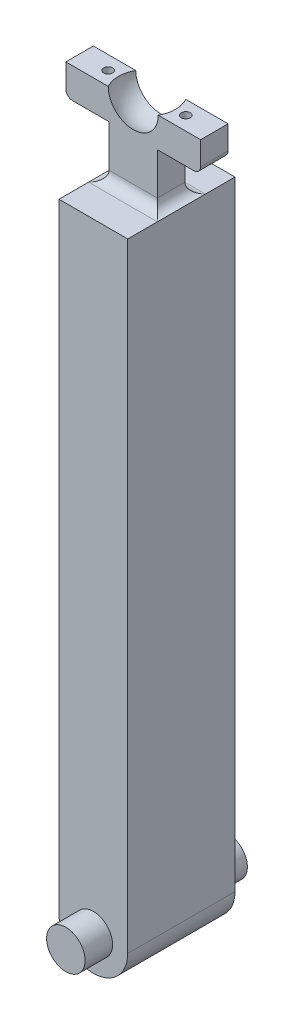
ISO-10303-21;
HEADER;
FILE_DESCRIPTION(('STEP AP214'),'2;1');
FILE_NAME('part.step','',(''),(''),'','','');
FILE_SCHEMA(('AUTOMOTIVE_DESIGN { 1 0 10303 214 1 1 1 1 }'));
ENDSEC;
DATA;
#1=APPLICATION_CONTEXT('core data for automotive mechanical design processes');
#2=APPLICATION_PROTOCOL_DEFINITION('international standard','automotive_design',2000,#1);
#3=PRODUCT_CONTEXT('',#1,'mechanical');
#4=PRODUCT('Part','Part','',(#3));
#5=PRODUCT_RELATED_PRODUCT_CATEGORY('part','',(#4));
#6=PRODUCT_DEFINITION_FORMATION('','',#4);
#7=PRODUCT_DEFINITION_CONTEXT('part definition',#1,'design');
#8=PRODUCT_DEFINITION('design','',#6,#7);
#9=PRODUCT_DEFINITION_SHAPE('','',#8);
#10=(LENGTH_UNIT() NAMED_UNIT(*) SI_UNIT(.MILLI.,.METRE.));
#11=(NAMED_UNIT(*) PLANE_ANGLE_UNIT() SI_UNIT($,.RADIAN.));
#12=(NAMED_UNIT(*) SI_UNIT($,.STERADIAN.) SOLID_ANGLE_UNIT());
#13=UNCERTAINTY_MEASURE_WITH_UNIT(LENGTH_MEASURE(1.E-05),#10,'distance_accuracy_value','');
#14=(GEOMETRIC_REPRESENTATION_CONTEXT(3) GLOBAL_UNCERTAINTY_ASSIGNED_CONTEXT((#13)) GLOBAL_UNIT_ASSIGNED_CONTEXT((#10,
#11,#12)) REPRESENTATION_CONTEXT('',''));
#15=CARTESIAN_POINT('',(0.,0.,0.));
#16=DIRECTION('',(0.,0.,1.));
#17=DIRECTION('',(1.,0.,0.));
#18=AXIS2_PLACEMENT_3D('',#15,#16,#17);
#19=CARTESIAN_POINT('',(0.,90.,7.8));
#20=DIRECTION('',(0.,-1.,0.));
#21=DIRECTION('',(0.,0.,-1.));
#22=AXIS2_PLACEMENT_3D('',#19,#20,#21);
#23=PLANE('',#22);
#24=DIRECTION('',(0.,0.,-1.));
#25=VECTOR('',#24,1.);
#26=CARTESIAN_POINT('',(5.,90.,7.8));
#27=LINE('',#26,#25);
#28=CARTESIAN_POINT('',(5.,90.,7.8));
#29=VERTEX_POINT('',#28);
#30=CARTESIAN_POINT('',(5.,90.,3.5));
#31=VERTEX_POINT('',#30);
#32=EDGE_CURVE('E234',#29,#31,#27,.T.);
#33=ORIENTED_EDGE('',*,*,#32,.T.);
#34=DIRECTION('',(1.,0.,0.));
#35=VECTOR('',#34,1.);
#36=CARTESIAN_POINT('',(0.,90.,3.5));
#37=LINE('',#36,#35);
#38=CARTESIAN_POINT('',(-5.,90.,3.5));
#39=VERTEX_POINT('',#38);
#40=EDGE_CURVE('E273',#31,#39,#37,.F.);
#41=ORIENTED_EDGE('',*,*,#40,.T.);
#42=DIRECTION('',(0.,0.,-1.));
#43=VECTOR('',#42,1.);
#44=CARTESIAN_POINT('',(-5.,90.,7.8));
#45=LINE('',#44,#43);
#46=CARTESIAN_POINT('',(-5.,90.,7.8));
#47=VERTEX_POINT('',#46);
#48=EDGE_CURVE('E245',#47,#39,#45,.T.);
#49=ORIENTED_EDGE('',*,*,#48,.F.);
#50=DIRECTION('',(-1.,0.,0.));
#51=VECTOR('',#50,1.);
#52=CARTESIAN_POINT('',(0.,90.,7.8));
#53=LINE('',#52,#51);
#54=EDGE_CURVE('E215',#29,#47,#53,.T.);
#55=ORIENTED_EDGE('',*,*,#54,.F.);
#56=EDGE_LOOP('',(#33,#41,#49,#55));
#57=FACE_BOUND('',#56,.T.);
#58=ADVANCED_FACE('F41',(#57),#23,.F.);
#59=CARTESIAN_POINT('',(-9.80000000000001,97.6,2.));
#60=DIRECTION('',(0.,1.,0.));
#61=DIRECTION('',(0.,0.,1.));
#62=AXIS2_PLACEMENT_3D('',#59,#60,#61);
#63=PLANE('',#62);
#64=DIRECTION('',(1.,0.,0.));
#65=VECTOR('',#64,1.);
#66=CARTESIAN_POINT('',(-9.80000000000001,97.6,2.));
#67=LINE('',#66,#65);
#68=CARTESIAN_POINT('',(-8.80000000000002,97.6,2.));
#69=VERTEX_POINT('',#68);
#70=CARTESIAN_POINT('',(-3.5,97.6,2.));
#71=VERTEX_POINT('',#70);
#72=EDGE_CURVE('E319',#69,#71,#67,.T.);
#73=ORIENTED_EDGE('',*,*,#72,.F.);
#74=DIRECTION('',(0.,0.,-1.));
#75=VECTOR('',#74,1.);
#76=CARTESIAN_POINT('',(-8.80000000000002,97.6,2.));
#77=LINE('',#76,#75);
#78=CARTESIAN_POINT('',(-8.80000000000002,97.6,-2.));
#79=VERTEX_POINT('',#78);
#80=EDGE_CURVE('E263',#69,#79,#77,.T.);
#81=ORIENTED_EDGE('',*,*,#80,.T.);
#82=DIRECTION('',(1.,0.,0.));
#83=VECTOR('',#82,1.);
#84=CARTESIAN_POINT('',(-9.80000000000001,97.6,-2.));
#85=LINE('',#84,#83);
#86=CARTESIAN_POINT('',(-3.5,97.6,-2.));
#87=VERTEX_POINT('',#86);
#88=EDGE_CURVE('E327',#79,#87,#85,.T.);
#89=ORIENTED_EDGE('',*,*,#88,.T.);
#90=DIRECTION('',(0.,0.,-1.));
#91=VECTOR('',#90,1.);
#92=CARTESIAN_POINT('',(-3.5,97.6,-2.));
#93=LINE('',#92,#91);
#94=EDGE_CURVE('E198',#71,#87,#93,.T.);
#95=ORIENTED_EDGE('',*,*,#94,.F.);
#96=EDGE_LOOP('',(#73,#81,#89,#95));
#97=FACE_BOUND('',#96,.T.);
#98=CARTESIAN_POINT('',(-5.65,97.6,0.));
#99=DIRECTION('',(0.,-1.,0.));
#100=DIRECTION('',(0.,0.,-1.));
#101=AXIS2_PLACEMENT_3D('',#98,#99,#100);
#102=CIRCLE('',#101,0.650000000000013);
#103=CARTESIAN_POINT('',(-5.65,97.6,-0.650000000000013));
#104=VERTEX_POINT('',#103);
#105=EDGE_CURVE('E287',#104,#104,#102,.T.);
#106=ORIENTED_EDGE('',*,*,#105,.F.);
#107=EDGE_LOOP('',(#106));
#108=FACE_BOUND('',#107,.T.);
#109=ADVANCED_FACE('F352',(#97,#108),#63,.F.);
#110=CARTESIAN_POINT('',(0.,102.,0.));
#111=DIRECTION('',(0.,1.,0.));
#112=DIRECTION('',(0.,0.,1.));
#113=AXIS2_PLACEMENT_3D('',#110,#111,#112);
#114=PLANE('',#113);
#115=CARTESIAN_POINT('',(-5.65,102.,0.));
#116=DIRECTION('',(0.,1.,0.));
#117=DIRECTION('',(0.,0.,1.));
#118=AXIS2_PLACEMENT_3D('',#115,#116,#117);
#119=CIRCLE('',#118,0.650000000000013);
#120=CARTESIAN_POINT('',(-5.65,102.,0.650000000000013));
#121=VERTEX_POINT('',#120);
#122=EDGE_CURVE('E293',#121,#121,#119,.T.);
#123=ORIENTED_EDGE('',*,*,#122,.F.);
#124=EDGE_LOOP('',(#123));
#125=FACE_BOUND('',#124,.T.);
#126=DIRECTION('',(1.,0.,0.));
#127=VECTOR('',#126,1.);
#128=CARTESIAN_POINT('',(-3.5,102.,2.));
#129=LINE('',#128,#127);
#130=CARTESIAN_POINT('',(-9.80000000000001,102.,2.));
#131=VERTEX_POINT('',#130);
#132=CARTESIAN_POINT('',(-3.63627556711535,102.,2.));
#133=VERTEX_POINT('',#132);
#134=EDGE_CURVE('E192',#131,#133,#129,.T.);
#135=ORIENTED_EDGE('',*,*,#134,.T.);
#136=CARTESIAN_POINT('',(0.,102.,0.));
#137=DIRECTION('',(0.,1.,0.));
#138=DIRECTION('',(0.,0.,1.));
#139=AXIS2_PLACEMENT_3D('',#136,#137,#138);
#140=CIRCLE('',#139,4.15);
#141=CARTESIAN_POINT('',(-3.63627556711535,102.,-2.));
#142=VERTEX_POINT('',#141);
#143=EDGE_CURVE('E171',#133,#142,#140,.F.);
#144=ORIENTED_EDGE('',*,*,#143,.T.);
#145=DIRECTION('',(-1.,0.,0.));
#146=VECTOR('',#145,1.);
#147=CARTESIAN_POINT('',(-3.5,102.,-2.));
#148=LINE('',#147,#146);
#149=CARTESIAN_POINT('',(-9.80000000000001,102.,-2.));
#150=VERTEX_POINT('',#149);
#151=EDGE_CURVE('E195',#142,#150,#148,.T.);
#152=ORIENTED_EDGE('',*,*,#151,.T.);
#153=DIRECTION('',(0.,0.,-1.));
#154=VECTOR('',#153,1.);
#155=CARTESIAN_POINT('',(-9.80000000000001,102.,2.));
#156=LINE('',#155,#154);
#157=EDGE_CURVE('E323',#131,#150,#156,.T.);
#158=ORIENTED_EDGE('',*,*,#157,.F.);
#159=EDGE_LOOP('',(#135,#144,#152,#158));
#160=FACE_BOUND('',#159,.T.);
#161=ADVANCED_FACE('F338',(#125,#160),#114,.T.);
#162=CARTESIAN_POINT('',(-3.5,81.9377422517015,-2.));
#163=DIRECTION('',(-1.,0.,0.));
#164=DIRECTION('',(0.,0.,1.));
#165=AXIS2_PLACEMENT_3D('',#162,#163,#164);
#166=PLANE('',#165);
#167=DIRECTION('',(0.,1.,0.));
#168=VECTOR('',#167,1.);
#169=CARTESIAN_POINT('',(-3.5,81.9377422517015,-2.));
#170=LINE('',#169,#168);
#171=CARTESIAN_POINT('',(-3.5,91.5,-2.));
#172=VERTEX_POINT('',#171);
#173=EDGE_CURVE('E194',#172,#87,#170,.T.);
#174=ORIENTED_EDGE('',*,*,#173,.F.);
#175=DIRECTION('',(0.,0.,1.));
#176=VECTOR('',#175,1.);
#177=CARTESIAN_POINT('',(-3.5,91.5,-2.));
#178=LINE('',#177,#176);
#179=CARTESIAN_POINT('',(-3.5,91.5,2.));
#180=VERTEX_POINT('',#179);
#181=EDGE_CURVE('E50',#172,#180,#178,.T.);
#182=ORIENTED_EDGE('',*,*,#181,.T.);
#183=DIRECTION('',(0.,1.,0.));
#184=VECTOR('',#183,1.);
#185=CARTESIAN_POINT('',(-3.5,81.9377422517015,2.));
#186=LINE('',#185,#184);
#187=EDGE_CURVE('E204',#180,#71,#186,.T.);
#188=ORIENTED_EDGE('',*,*,#187,.T.);
#189=ORIENTED_EDGE('',*,*,#94,.T.);
#190=EDGE_LOOP('',(#174,#182,#188,#189));
#191=FACE_BOUND('',#190,.T.);
#192=ADVANCED_FACE('F411',(#191),#166,.T.);
#193=CARTESIAN_POINT('',(3.5,81.9377422517015,-2.));
#194=DIRECTION('',(1.,0.,0.));
#195=DIRECTION('',(0.,0.,-1.));
#196=AXIS2_PLACEMENT_3D('',#193,#194,#195);
#197=PLANE('',#196);
#198=DIRECTION('',(0.,1.,0.));
#199=VECTOR('',#198,1.);
#200=CARTESIAN_POINT('',(3.5,81.9377422517015,2.));
#201=LINE('',#200,#199);
#202=CARTESIAN_POINT('',(3.5,91.5,2.));
#203=VERTEX_POINT('',#202);
#204=CARTESIAN_POINT('',(3.5,97.6,2.));
#205=VERTEX_POINT('',#204);
#206=EDGE_CURVE('E201',#203,#205,#201,.T.);
#207=ORIENTED_EDGE('',*,*,#206,.F.);
#208=DIRECTION('',(0.,0.,-1.));
#209=VECTOR('',#208,1.);
#210=CARTESIAN_POINT('',(3.5,91.5,-2.));
#211=LINE('',#210,#209);
#212=CARTESIAN_POINT('',(3.5,91.5,-2.));
#213=VERTEX_POINT('',#212);
#214=EDGE_CURVE('E268',#203,#213,#211,.T.);
#215=ORIENTED_EDGE('',*,*,#214,.T.);
#216=DIRECTION('',(0.,1.,0.));
#217=VECTOR('',#216,1.);
#218=CARTESIAN_POINT('',(3.5,81.9377422517015,-2.));
#219=LINE('',#218,#217);
#220=CARTESIAN_POINT('',(3.5,97.6,-2.));
#221=VERTEX_POINT('',#220);
#222=EDGE_CURVE('E203',#213,#221,#219,.T.);
#223=ORIENTED_EDGE('',*,*,#222,.T.);
#224=DIRECTION('',(0.,0.,1.));
#225=VECTOR('',#224,1.);
#226=CARTESIAN_POINT('',(3.5,97.6,-2.));
#227=LINE('',#226,#225);
#228=EDGE_CURVE('E176',#221,#205,#227,.T.);
#229=ORIENTED_EDGE('',*,*,#228,.T.);
#230=EDGE_LOOP('',(#207,#215,#223,#229));
#231=FACE_BOUND('',#230,.T.);
#232=ADVANCED_FACE('F367',(#231),#197,.T.);
#233=CARTESIAN_POINT('',(-5.,90.,-3.5));
#234=VERTEX_POINT('',#233);
#235=CARTESIAN_POINT('',(-5.,90.,-7.8));
#236=VERTEX_POINT('',#235);
#237=EDGE_CURVE('E244',#234,#236,#45,.T.);
#238=ORIENTED_EDGE('',*,*,#237,.F.);
#239=DIRECTION('',(-1.,0.,0.));
#240=VECTOR('',#239,1.);
#241=CARTESIAN_POINT('',(0.,90.,-3.5));
#242=LINE('',#241,#240);
#243=CARTESIAN_POINT('',(5.,90.,-3.5));
#244=VERTEX_POINT('',#243);
#245=EDGE_CURVE('E271',#234,#244,#242,.F.);
#246=ORIENTED_EDGE('',*,*,#245,.T.);
#247=CARTESIAN_POINT('',(5.,90.,-7.8));
#248=VERTEX_POINT('',#247);
#249=EDGE_CURVE('E225',#244,#248,#27,.T.);
#250=ORIENTED_EDGE('',*,*,#249,.T.);
#251=DIRECTION('',(-1.,0.,0.));
#252=VECTOR('',#251,1.);
#253=CARTESIAN_POINT('',(0.,90.,-7.8));
#254=LINE('',#253,#252);
#255=EDGE_CURVE('E212',#248,#236,#254,.T.);
#256=ORIENTED_EDGE('',*,*,#255,.T.);
#257=EDGE_LOOP('',(#238,#246,#250,#256));
#258=FACE_BOUND('',#257,.T.);
#259=ADVANCED_FACE('F396',(#258),#23,.F.);
#260=CARTESIAN_POINT('',(-5.,0.,7.8));
#261=DIRECTION('',(1.,0.,0.));
#262=DIRECTION('',(0.,0.,-1.));
#263=AXIS2_PLACEMENT_3D('',#260,#261,#262);
#264=PLANE('',#263);
#265=DIRECTION('',(0.,-1.,0.));
#266=VECTOR('',#265,1.);
#267=CARTESIAN_POINT('',(-5.,0.,-7.8));
#268=LINE('',#267,#266);
#269=CARTESIAN_POINT('',(-5.,0.,-7.8));
#270=VERTEX_POINT('',#269);
#271=EDGE_CURVE('E228',#236,#270,#268,.T.);
#272=ORIENTED_EDGE('',*,*,#271,.T.);
#273=DIRECTION('',(0.,0.,-1.));
#274=VECTOR('',#273,1.);
#275=CARTESIAN_POINT('',(-5.,0.,7.8));
#276=LINE('',#275,#274);
#277=CARTESIAN_POINT('',(-5.,0.,7.8));
#278=VERTEX_POINT('',#277);
#279=EDGE_CURVE('E241',#278,#270,#276,.T.);
#280=ORIENTED_EDGE('',*,*,#279,.F.);
#281=DIRECTION('',(0.,-1.,0.));
#282=VECTOR('',#281,1.);
#283=CARTESIAN_POINT('',(-5.,0.,7.8));
#284=LINE('',#283,#282);
#285=EDGE_CURVE('E218',#47,#278,#284,.T.);
#286=ORIENTED_EDGE('',*,*,#285,.F.);
#287=ORIENTED_EDGE('',*,*,#48,.T.);
#288=EDGE_CURVE('E248',#39,#234,#45,.T.);
#289=ORIENTED_EDGE('',*,*,#288,.T.);
#290=ORIENTED_EDGE('',*,*,#237,.T.);
#291=EDGE_LOOP('',(#272,#280,#286,#287,#289,#290));
#292=FACE_BOUND('',#291,.T.);
#293=ADVANCED_FACE('F403',(#292),#264,.F.);
#294=CARTESIAN_POINT('',(0.,0.,7.8));
#295=DIRECTION('',(0.,0.,-1.));
#296=DIRECTION('',(-1.,0.,0.));
#297=AXIS2_PLACEMENT_3D('',#294,#295,#296);
#298=CYLINDRICAL_SURFACE('',#297,5.);
#299=CARTESIAN_POINT('',(0.,0.,-7.8));
#300=DIRECTION('',(0.,0.,1.));
#301=DIRECTION('',(1.,0.,0.));
#302=AXIS2_PLACEMENT_3D('',#299,#300,#301);
#303=CIRCLE('',#302,5.);
#304=CARTESIAN_POINT('',(5.,0.,-7.8));
#305=VERTEX_POINT('',#304);
#306=EDGE_CURVE('E230',#270,#305,#303,.T.);
#307=ORIENTED_EDGE('',*,*,#306,.T.);
#308=DIRECTION('',(0.,0.,-1.));
#309=VECTOR('',#308,1.);
#310=CARTESIAN_POINT('',(5.,0.,7.8));
#311=LINE('',#310,#309);
#312=CARTESIAN_POINT('',(5.,0.,7.8));
#313=VERTEX_POINT('',#312);
#314=EDGE_CURVE('E237',#313,#305,#311,.T.);
#315=ORIENTED_EDGE('',*,*,#314,.F.);
#316=CARTESIAN_POINT('',(0.,0.,7.8));
#317=DIRECTION('',(0.,0.,1.));
#318=DIRECTION('',(1.,0.,0.));
#319=AXIS2_PLACEMENT_3D('',#316,#317,#318);
#320=CIRCLE('',#319,5.);
#321=EDGE_CURVE('E221',#278,#313,#320,.T.);
#322=ORIENTED_EDGE('',*,*,#321,.F.);
#323=ORIENTED_EDGE('',*,*,#279,.T.);
#324=EDGE_LOOP('',(#307,#315,#322,#323));
#325=FACE_BOUND('',#324,.T.);
#326=ADVANCED_FACE('F409',(#325),#298,.T.);
#327=CARTESIAN_POINT('',(5.,0.,7.8));
#328=DIRECTION('',(-1.,0.,0.));
#329=DIRECTION('',(0.,0.,1.));
#330=AXIS2_PLACEMENT_3D('',#327,#328,#329);
#331=PLANE('',#330);
#332=DIRECTION('',(0.,1.,0.));
#333=VECTOR('',#332,1.);
#334=CARTESIAN_POINT('',(5.,0.,-7.8));
#335=LINE('',#334,#333);
#336=EDGE_CURVE('E219',#305,#248,#335,.T.);
#337=ORIENTED_EDGE('',*,*,#336,.T.);
#338=ORIENTED_EDGE('',*,*,#249,.F.);
#339=EDGE_CURVE('E238',#31,#244,#27,.T.);
#340=ORIENTED_EDGE('',*,*,#339,.F.);
#341=ORIENTED_EDGE('',*,*,#32,.F.);
#342=DIRECTION('',(0.,1.,0.));
#343=VECTOR('',#342,1.);
#344=CARTESIAN_POINT('',(5.,0.,7.8));
#345=LINE('',#344,#343);
#346=EDGE_CURVE('E223',#313,#29,#345,.T.);
#347=ORIENTED_EDGE('',*,*,#346,.F.);
#348=ORIENTED_EDGE('',*,*,#314,.T.);
#349=EDGE_LOOP('',(#337,#338,#340,#341,#347,#348));
#350=FACE_BOUND('',#349,.T.);
#351=ADVANCED_FACE('F471',(#350),#331,.F.);
#352=CARTESIAN_POINT('',(0.,0.,7.8));
#353=DIRECTION('',(0.,0.,1.));
#354=DIRECTION('',(1.,0.,0.));
#355=AXIS2_PLACEMENT_3D('',#352,#353,#354);
#356=PLANE('',#355);
#357=CARTESIAN_POINT('',(0.,0.,7.8));
#358=DIRECTION('',(0.,0.,1.));
#359=DIRECTION('',(1.,0.,0.));
#360=AXIS2_PLACEMENT_3D('',#357,#358,#359);
#361=CIRCLE('',#360,2.8);
#362=CARTESIAN_POINT('',(2.8,0.,7.8));
#363=VERTEX_POINT('',#362);
#364=EDGE_CURVE('E208',#363,#363,#361,.T.);
#365=ORIENTED_EDGE('',*,*,#364,.F.);
#366=EDGE_LOOP('',(#365));
#367=FACE_BOUND('',#366,.T.);
#368=ORIENTED_EDGE('',*,*,#54,.T.);
#369=ORIENTED_EDGE('',*,*,#285,.T.);
#370=ORIENTED_EDGE('',*,*,#321,.T.);
#371=ORIENTED_EDGE('',*,*,#346,.T.);
#372=EDGE_LOOP('',(#368,#369,#370,#371));
#373=FACE_BOUND('',#372,.T.);
#374=ADVANCED_FACE('F468',(#367,#373),#356,.T.);
#375=CARTESIAN_POINT('',(0.,0.,-7.8));
#376=DIRECTION('',(0.,0.,1.));
#377=DIRECTION('',(1.,0.,0.));
#378=AXIS2_PLACEMENT_3D('',#375,#376,#377);
#379=PLANE('',#378);
#380=CARTESIAN_POINT('',(0.,0.,-7.8));
#381=DIRECTION('',(0.,0.,1.));
#382=DIRECTION('',(1.,0.,0.));
#383=AXIS2_PLACEMENT_3D('',#380,#381,#382);
#384=CIRCLE('',#383,2.8);
#385=CARTESIAN_POINT('',(2.8,0.,-7.8));
#386=VERTEX_POINT('',#385);
#387=EDGE_CURVE('E306',#386,#386,#384,.T.);
#388=ORIENTED_EDGE('',*,*,#387,.T.);
#389=EDGE_LOOP('',(#388));
#390=FACE_BOUND('',#389,.T.);
#391=ORIENTED_EDGE('',*,*,#255,.F.);
#392=ORIENTED_EDGE('',*,*,#336,.F.);
#393=ORIENTED_EDGE('',*,*,#306,.F.);
#394=ORIENTED_EDGE('',*,*,#271,.F.);
#395=EDGE_LOOP('',(#391,#392,#393,#394));
#396=FACE_BOUND('',#395,.T.);
#397=ADVANCED_FACE('F466',(#390,#396),#379,.F.);
#398=CARTESIAN_POINT('',(0.,0.,11.8));
#399=DIRECTION('',(0.,0.,-1.));
#400=DIRECTION('',(-1.,0.,0.));
#401=AXIS2_PLACEMENT_3D('',#398,#399,#400);
#402=CYLINDRICAL_SURFACE('',#401,2.8);
#403=CARTESIAN_POINT('',(0.,0.,11.8));
#404=DIRECTION('',(0.,0.,1.));
#405=DIRECTION('',(1.,0.,0.));
#406=AXIS2_PLACEMENT_3D('',#403,#404,#405);
#407=CIRCLE('',#406,2.8);
#408=CARTESIAN_POINT('',(2.8,0.,11.8));
#409=VERTEX_POINT('',#408);
#410=EDGE_CURVE('E209',#409,#409,#407,.T.);
#411=ORIENTED_EDGE('',*,*,#410,.F.);
#412=EDGE_LOOP('',(#411));
#413=FACE_BOUND('',#412,.T.);
#414=ORIENTED_EDGE('',*,*,#364,.T.);
#415=EDGE_LOOP('',(#414));
#416=FACE_BOUND('',#415,.T.);
#417=ADVANCED_FACE('F462',(#413,#416),#402,.T.);
#418=CARTESIAN_POINT('',(0.,0.,11.8));
#419=DIRECTION('',(0.,0.,1.));
#420=DIRECTION('',(1.,0.,0.));
#421=AXIS2_PLACEMENT_3D('',#418,#419,#420);
#422=PLANE('',#421);
#423=ORIENTED_EDGE('',*,*,#410,.T.);
#424=EDGE_LOOP('',(#423));
#425=FACE_BOUND('',#424,.T.);
#426=ADVANCED_FACE('F453',(#425),#422,.T.);
#427=CARTESIAN_POINT('',(5.64999999998962,102.,2.67999409510405E-11));
#428=DIRECTION('',(0.,1.,0.));
#429=DIRECTION('',(0.,0.,1.));
#430=AXIS2_PLACEMENT_3D('',#427,#428,#429);
#431=CIRCLE('',#430,0.650000000000013);
#432=CARTESIAN_POINT('',(5.64999999998962,102.,0.650000000026813));
#433=VERTEX_POINT('',#432);
#434=EDGE_CURVE('E303',#433,#433,#431,.T.);
#435=ORIENTED_EDGE('',*,*,#434,.F.);
#436=EDGE_LOOP('',(#435));
#437=FACE_BOUND('',#436,.T.);
#438=CARTESIAN_POINT('',(9.80000000000001,102.,-2.));
#439=VERTEX_POINT('',#438);
#440=CARTESIAN_POINT('',(3.63627556711534,102.,-2.));
#441=VERTEX_POINT('',#440);
#442=EDGE_CURVE('E186',#439,#441,#148,.T.);
#443=ORIENTED_EDGE('',*,*,#442,.T.);
#444=CARTESIAN_POINT('',(3.63627556711534,102.,2.));
#445=VERTEX_POINT('',#444);
#446=EDGE_CURVE('E168',#441,#445,#140,.F.);
#447=ORIENTED_EDGE('',*,*,#446,.T.);
#448=CARTESIAN_POINT('',(9.80000000000001,102.,2.));
#449=VERTEX_POINT('',#448);
#450=EDGE_CURVE('E183',#445,#449,#129,.T.);
#451=ORIENTED_EDGE('',*,*,#450,.T.);
#452=DIRECTION('',(0.,0.,-1.));
#453=VECTOR('',#452,1.);
#454=CARTESIAN_POINT('',(9.80000000000001,102.,2.));
#455=LINE('',#454,#453);
#456=EDGE_CURVE('E332',#449,#439,#455,.T.);
#457=ORIENTED_EDGE('',*,*,#456,.T.);
#458=EDGE_LOOP('',(#443,#447,#451,#457));
#459=FACE_BOUND('',#458,.T.);
#460=ADVANCED_FACE('F181',(#437,#459),#114,.T.);
#461=CARTESIAN_POINT('',(-3.5,81.9377422517015,-2.));
#462=DIRECTION('',(0.,0.,-1.));
#463=DIRECTION('',(-1.,0.,0.));
#464=AXIS2_PLACEMENT_3D('',#461,#462,#463);
#465=PLANE('',#464);
#466=ORIENTED_EDGE('',*,*,#222,.F.);
#467=DIRECTION('',(-1.,0.,0.));
#468=VECTOR('',#467,1.);
#469=CARTESIAN_POINT('',(-3.5,91.5,-2.));
#470=LINE('',#469,#468);
#471=EDGE_CURVE('E11',#213,#172,#470,.T.);
#472=ORIENTED_EDGE('',*,*,#471,.T.);
#473=ORIENTED_EDGE('',*,*,#173,.T.);
#474=ORIENTED_EDGE('',*,*,#88,.F.);
#475=CARTESIAN_POINT('',(-8.80000000000002,98.6,-2.));
#476=DIRECTION('',(0.,0.,-1.));
#477=DIRECTION('',(-1.,0.,0.));
#478=AXIS2_PLACEMENT_3D('',#475,#476,#477);
#479=CIRCLE('',#478,1.);
#480=CARTESIAN_POINT('',(-9.80000000000001,98.6,-2.));
#481=VERTEX_POINT('',#480);
#482=EDGE_CURVE('E253',#79,#481,#479,.T.);
#483=ORIENTED_EDGE('',*,*,#482,.T.);
#484=DIRECTION('',(0.,-1.,0.));
#485=VECTOR('',#484,1.);
#486=CARTESIAN_POINT('',(-9.80000000000001,102.,-2.));
#487=LINE('',#486,#485);
#488=EDGE_CURVE('E313',#150,#481,#487,.T.);
#489=ORIENTED_EDGE('',*,*,#488,.F.);
#490=ORIENTED_EDGE('',*,*,#151,.F.);
#491=CARTESIAN_POINT('',(0.,102.,-2.));
#492=DIRECTION('',(0.,0.,-1.));
#493=DIRECTION('',(-1.,0.,0.));
#494=AXIS2_PLACEMENT_3D('',#491,#492,#493);
#495=CIRCLE('',#494,3.63627556711534);
#496=EDGE_CURVE('E311',#142,#441,#495,.F.);
#497=ORIENTED_EDGE('',*,*,#496,.T.);
#498=ORIENTED_EDGE('',*,*,#442,.F.);
#499=DIRECTION('',(0.,1.,0.));
#500=VECTOR('',#499,1.);
#501=CARTESIAN_POINT('',(9.80000000000001,102.,-2.));
#502=LINE('',#501,#500);
#503=CARTESIAN_POINT('',(9.79999999999999,98.6,-2.));
#504=VERTEX_POINT('',#503);
#505=EDGE_CURVE('E318',#504,#439,#502,.T.);
#506=ORIENTED_EDGE('',*,*,#505,.F.);
#507=CARTESIAN_POINT('',(8.8,98.6,-2.));
#508=DIRECTION('',(0.,0.,-1.));
#509=DIRECTION('',(-1.,0.,0.));
#510=AXIS2_PLACEMENT_3D('',#507,#508,#509);
#511=CIRCLE('',#510,1.);
#512=CARTESIAN_POINT('',(8.8,97.6,-2.));
#513=VERTEX_POINT('',#512);
#514=EDGE_CURVE('E255',#504,#513,#511,.T.);
#515=ORIENTED_EDGE('',*,*,#514,.T.);
#516=EDGE_CURVE('E326',#221,#513,#85,.T.);
#517=ORIENTED_EDGE('',*,*,#516,.F.);
#518=EDGE_LOOP('',(#466,#472,#473,#474,#483,#489,#490,#497,#498,#506,#515,#517));
#519=FACE_BOUND('',#518,.T.);
#520=ADVANCED_FACE('F344',(#519),#465,.T.);
#521=CARTESIAN_POINT('',(-3.5,81.9377422517015,2.));
#522=DIRECTION('',(0.,0.,1.));
#523=DIRECTION('',(1.,0.,0.));
#524=AXIS2_PLACEMENT_3D('',#521,#522,#523);
#525=PLANE('',#524);
#526=ORIENTED_EDGE('',*,*,#187,.F.);
#527=DIRECTION('',(1.,0.,0.));
#528=VECTOR('',#527,1.);
#529=CARTESIAN_POINT('',(-3.5,91.5,2.));
#530=LINE('',#529,#528);
#531=EDGE_CURVE('E275',#180,#203,#530,.T.);
#532=ORIENTED_EDGE('',*,*,#531,.T.);
#533=ORIENTED_EDGE('',*,*,#206,.T.);
#534=CARTESIAN_POINT('',(8.8,97.6,2.));
#535=VERTEX_POINT('',#534);
#536=EDGE_CURVE('E317',#205,#535,#67,.T.);
#537=ORIENTED_EDGE('',*,*,#536,.T.);
#538=CARTESIAN_POINT('',(8.8,98.6,2.));
#539=DIRECTION('',(0.,0.,1.));
#540=DIRECTION('',(1.,0.,0.));
#541=AXIS2_PLACEMENT_3D('',#538,#539,#540);
#542=CIRCLE('',#541,1.);
#543=CARTESIAN_POINT('',(9.79999999999999,98.6,2.));
#544=VERTEX_POINT('',#543);
#545=EDGE_CURVE('E261',#535,#544,#542,.T.);
#546=ORIENTED_EDGE('',*,*,#545,.T.);
#547=DIRECTION('',(0.,1.,0.));
#548=VECTOR('',#547,1.);
#549=CARTESIAN_POINT('',(9.80000000000001,102.,2.));
#550=LINE('',#549,#548);
#551=EDGE_CURVE('E191',#544,#449,#550,.T.);
#552=ORIENTED_EDGE('',*,*,#551,.T.);
#553=ORIENTED_EDGE('',*,*,#450,.F.);
#554=CARTESIAN_POINT('',(0.,102.,2.));
#555=DIRECTION('',(0.,0.,1.));
#556=DIRECTION('',(1.,0.,0.));
#557=AXIS2_PLACEMENT_3D('',#554,#555,#556);
#558=CIRCLE('',#557,3.63627556711534);
#559=EDGE_CURVE('E165',#445,#133,#558,.F.);
#560=ORIENTED_EDGE('',*,*,#559,.T.);
#561=ORIENTED_EDGE('',*,*,#134,.F.);
#562=DIRECTION('',(0.,-1.,0.));
#563=VECTOR('',#562,1.);
#564=CARTESIAN_POINT('',(-9.80000000000001,102.,2.));
#565=LINE('',#564,#563);
#566=CARTESIAN_POINT('',(-9.80000000000001,98.6,2.));
#567=VERTEX_POINT('',#566);
#568=EDGE_CURVE('E314',#131,#567,#565,.T.);
#569=ORIENTED_EDGE('',*,*,#568,.T.);
#570=CARTESIAN_POINT('',(-8.80000000000002,98.6,2.));
#571=DIRECTION('',(0.,0.,1.));
#572=DIRECTION('',(1.,0.,0.));
#573=AXIS2_PLACEMENT_3D('',#570,#571,#572);
#574=CIRCLE('',#573,1.);
#575=EDGE_CURVE('E259',#567,#69,#574,.T.);
#576=ORIENTED_EDGE('',*,*,#575,.T.);
#577=ORIENTED_EDGE('',*,*,#72,.T.);
#578=EDGE_LOOP('',(#526,#532,#533,#537,#546,#552,#553,#560,#561,#569,#576,#577));
#579=FACE_BOUND('',#578,.T.);
#580=ADVANCED_FACE('F189',(#579),#525,.T.);
#581=CARTESIAN_POINT('',(9.80000000000001,102.,2.));
#582=DIRECTION('',(-1.,0.,0.));
#583=DIRECTION('',(0.,-1.,0.));
#584=AXIS2_PLACEMENT_3D('',#581,#582,#583);
#585=PLANE('',#584);
#586=ORIENTED_EDGE('',*,*,#551,.F.);
#587=DIRECTION('',(0.,0.,-1.));
#588=VECTOR('',#587,1.);
#589=CARTESIAN_POINT('',(9.79999999999999,98.6,2.));
#590=LINE('',#589,#588);
#591=EDGE_CURVE('E175',#544,#504,#590,.T.);
#592=ORIENTED_EDGE('',*,*,#591,.T.);
#593=ORIENTED_EDGE('',*,*,#505,.T.);
#594=ORIENTED_EDGE('',*,*,#456,.F.);
#595=EDGE_LOOP('',(#586,#592,#593,#594));
#596=FACE_BOUND('',#595,.T.);
#597=ADVANCED_FACE('F382',(#596),#585,.F.);
#598=CARTESIAN_POINT('',(5.64999999998962,97.6,2.67999409510405E-11));
#599=DIRECTION('',(0.,-1.,0.));
#600=DIRECTION('',(0.,0.,-1.));
#601=AXIS2_PLACEMENT_3D('',#598,#599,#600);
#602=CIRCLE('',#601,0.650000000000013);
#603=CARTESIAN_POINT('',(5.64999999998962,97.6,-0.649999999973213));
#604=VERTEX_POINT('',#603);
#605=EDGE_CURVE('E298',#604,#604,#602,.T.);
#606=ORIENTED_EDGE('',*,*,#605,.F.);
#607=EDGE_LOOP('',(#606));
#608=FACE_BOUND('',#607,.T.);
#609=ORIENTED_EDGE('',*,*,#516,.T.);
#610=DIRECTION('',(0.,0.,-1.));
#611=VECTOR('',#610,1.);
#612=CARTESIAN_POINT('',(8.8,97.6,2.));
#613=LINE('',#612,#611);
#614=EDGE_CURVE('E257',#513,#535,#613,.F.);
#615=ORIENTED_EDGE('',*,*,#614,.T.);
#616=ORIENTED_EDGE('',*,*,#536,.F.);
#617=ORIENTED_EDGE('',*,*,#228,.F.);
#618=EDGE_LOOP('',(#609,#615,#616,#617));
#619=FACE_BOUND('',#618,.T.);
#620=ADVANCED_FACE('F374',(#608,#619),#63,.F.);
#621=CARTESIAN_POINT('',(-9.80000000000001,102.,2.));
#622=DIRECTION('',(1.,0.,0.));
#623=DIRECTION('',(0.,0.,-1.));
#624=AXIS2_PLACEMENT_3D('',#621,#622,#623);
#625=PLANE('',#624);
#626=ORIENTED_EDGE('',*,*,#488,.T.);
#627=DIRECTION('',(0.,0.,-1.));
#628=VECTOR('',#627,1.);
#629=CARTESIAN_POINT('',(-9.80000000000001,98.6,2.));
#630=LINE('',#629,#628);
#631=EDGE_CURVE('E266',#481,#567,#630,.F.);
#632=ORIENTED_EDGE('',*,*,#631,.T.);
#633=ORIENTED_EDGE('',*,*,#568,.F.);
#634=ORIENTED_EDGE('',*,*,#157,.T.);
#635=EDGE_LOOP('',(#626,#632,#633,#634));
#636=FACE_BOUND('',#635,.T.);
#637=ADVANCED_FACE('F342',(#636),#625,.F.);
#638=CARTESIAN_POINT('',(0.,102.,0.));
#639=DIRECTION('',(0.,1.,0.));
#640=DIRECTION('',(1.,0.,0.));
#641=AXIS2_PLACEMENT_3D('',#638,#639,#640);
#642=SPHERICAL_SURFACE('',#641,4.15);
#643=ORIENTED_EDGE('',*,*,#143,.F.);
#644=ORIENTED_EDGE('',*,*,#559,.F.);
#645=ORIENTED_EDGE('',*,*,#446,.F.);
#646=ORIENTED_EDGE('',*,*,#496,.F.);
#647=EDGE_LOOP('',(#643,#644,#645,#646));
#648=FACE_BOUND('',#647,.T.);
#649=ADVANCED_FACE('F167',(#648),#642,.F.);
#650=CARTESIAN_POINT('',(0.,0.,-11.8));
#651=DIRECTION('',(0.,0.,1.));
#652=DIRECTION('',(1.,0.,0.));
#653=AXIS2_PLACEMENT_3D('',#650,#651,#652);
#654=CYLINDRICAL_SURFACE('',#653,2.8);
#655=CARTESIAN_POINT('',(0.,0.,-11.8));
#656=DIRECTION('',(0.,0.,1.));
#657=DIRECTION('',(1.,0.,0.));
#658=AXIS2_PLACEMENT_3D('',#655,#656,#657);
#659=CIRCLE('',#658,2.8);
#660=CARTESIAN_POINT('',(2.8,0.,-11.8));
#661=VERTEX_POINT('',#660);
#662=EDGE_CURVE('E187',#661,#661,#659,.T.);
#663=ORIENTED_EDGE('',*,*,#662,.T.);
#664=EDGE_LOOP('',(#663));
#665=FACE_BOUND('',#664,.T.);
#666=ORIENTED_EDGE('',*,*,#387,.F.);
#667=EDGE_LOOP('',(#666));
#668=FACE_BOUND('',#667,.T.);
#669=ADVANCED_FACE('F433',(#665,#668),#654,.T.);
#670=CARTESIAN_POINT('',(0.,0.,-11.8));
#671=DIRECTION('',(0.,0.,-1.));
#672=DIRECTION('',(1.,0.,0.));
#673=AXIS2_PLACEMENT_3D('',#670,#671,#672);
#674=PLANE('',#673);
#675=ORIENTED_EDGE('',*,*,#662,.F.);
#676=EDGE_LOOP('',(#675));
#677=FACE_BOUND('',#676,.T.);
#678=ADVANCED_FACE('F429',(#677),#674,.T.);
#679=CARTESIAN_POINT('',(8.8,98.6,2.));
#680=DIRECTION('',(0.,0.,-1.));
#681=DIRECTION('',(-1.,0.,0.));
#682=AXIS2_PLACEMENT_3D('',#679,#680,#681);
#683=CYLINDRICAL_SURFACE('',#682,1.);
#684=ORIENTED_EDGE('',*,*,#545,.F.);
#685=ORIENTED_EDGE('',*,*,#614,.F.);
#686=ORIENTED_EDGE('',*,*,#514,.F.);
#687=ORIENTED_EDGE('',*,*,#591,.F.);
#688=EDGE_LOOP('',(#684,#685,#686,#687));
#689=FACE_BOUND('',#688,.T.);
#690=ADVANCED_FACE('F379',(#689),#683,.T.);
#691=CARTESIAN_POINT('',(-8.80000000000002,98.6,2.));
#692=DIRECTION('',(0.,0.,-1.));
#693=DIRECTION('',(-1.,0.,0.));
#694=AXIS2_PLACEMENT_3D('',#691,#692,#693);
#695=CYLINDRICAL_SURFACE('',#694,1.);
#696=ORIENTED_EDGE('',*,*,#575,.F.);
#697=ORIENTED_EDGE('',*,*,#631,.F.);
#698=ORIENTED_EDGE('',*,*,#482,.F.);
#699=ORIENTED_EDGE('',*,*,#80,.F.);
#700=EDGE_LOOP('',(#696,#697,#698,#699));
#701=FACE_BOUND('',#700,.T.);
#702=ADVANCED_FACE('F349',(#701),#695,.T.);
#703=CARTESIAN_POINT('',(5.64999999998962,97.6,2.67999409510405E-11));
#704=DIRECTION('',(0.,-1.,0.));
#705=DIRECTION('',(0.,0.,-1.));
#706=AXIS2_PLACEMENT_3D('',#703,#704,#705);
#707=CYLINDRICAL_SURFACE('',#706,0.650000000000013);
#708=ORIENTED_EDGE('',*,*,#605,.T.);
#709=EDGE_LOOP('',(#708));
#710=FACE_BOUND('',#709,.T.);
#711=ORIENTED_EDGE('',*,*,#434,.T.);
#712=EDGE_LOOP('',(#711));
#713=FACE_BOUND('',#712,.T.);
#714=ADVANCED_FACE('F427',(#710,#713),#707,.F.);
#715=CARTESIAN_POINT('',(-5.65,97.6,0.));
#716=DIRECTION('',(0.,-1.,0.));
#717=DIRECTION('',(0.,0.,-1.));
#718=AXIS2_PLACEMENT_3D('',#715,#716,#717);
#719=CYLINDRICAL_SURFACE('',#718,0.650000000000013);
#720=ORIENTED_EDGE('',*,*,#105,.T.);
#721=EDGE_LOOP('',(#720));
#722=FACE_BOUND('',#721,.T.);
#723=ORIENTED_EDGE('',*,*,#122,.T.);
#724=EDGE_LOOP('',(#723));
#725=FACE_BOUND('',#724,.T.);
#726=ADVANCED_FACE('F541',(#722,#725),#719,.F.);
#727=CARTESIAN_POINT('',(-5.,91.5,-2.));
#728=DIRECTION('',(0.,0.,1.));
#729=DIRECTION('',(1.,0.,0.));
#730=AXIS2_PLACEMENT_3D('',#727,#728,#729);
#731=CYLINDRICAL_SURFACE('',#730,1.5);
#732=CARTESIAN_POINT('',(-5.,91.5,-3.5));
#733=DIRECTION('',(-0.707106781186547,0.,0.707106781186547));
#734=DIRECTION('',(-0.707106781186547,0.,-0.707106781186547));
#735=AXIS2_PLACEMENT_3D('',#732,#733,#734);
#736=ELLIPSE('',#735,2.12132034355964,1.5);
#737=EDGE_CURVE('E281',#234,#172,#736,.T.);
#738=ORIENTED_EDGE('',*,*,#737,.F.);
#739=ORIENTED_EDGE('',*,*,#288,.F.);
#740=CARTESIAN_POINT('',(-5.,91.5,3.5));
#741=DIRECTION('',(0.707106781186547,0.,0.707106781186547));
#742=DIRECTION('',(-0.707106781186547,0.,0.707106781186547));
#743=AXIS2_PLACEMENT_3D('',#740,#741,#742);
#744=ELLIPSE('',#743,2.12132034355964,1.5);
#745=EDGE_CURVE('E45',#180,#39,#744,.F.);
#746=ORIENTED_EDGE('',*,*,#745,.F.);
#747=ORIENTED_EDGE('',*,*,#181,.F.);
#748=EDGE_LOOP('',(#738,#739,#746,#747));
#749=FACE_BOUND('',#748,.T.);
#750=ADVANCED_FACE('F43',(#749),#731,.F.);
#751=CARTESIAN_POINT('',(-3.5,91.5,3.5));
#752=DIRECTION('',(1.,0.,0.));
#753=DIRECTION('',(0.,0.,-1.));
#754=AXIS2_PLACEMENT_3D('',#751,#752,#753);
#755=CYLINDRICAL_SURFACE('',#754,1.5);
#756=ORIENTED_EDGE('',*,*,#745,.T.);
#757=ORIENTED_EDGE('',*,*,#40,.F.);
#758=CARTESIAN_POINT('',(5.,91.5,3.5));
#759=DIRECTION('',(0.707106781186547,0.,-0.707106781186548));
#760=DIRECTION('',(0.707106781186547,0.,0.707106781186547));
#761=AXIS2_PLACEMENT_3D('',#758,#759,#760);
#762=ELLIPSE('',#761,2.12132034355964,1.5);
#763=EDGE_CURVE('E280',#203,#31,#762,.F.);
#764=ORIENTED_EDGE('',*,*,#763,.F.);
#765=ORIENTED_EDGE('',*,*,#531,.F.);
#766=EDGE_LOOP('',(#756,#757,#764,#765));
#767=FACE_BOUND('',#766,.T.);
#768=ADVANCED_FACE('F359',(#767),#755,.F.);
#769=CARTESIAN_POINT('',(-3.5,91.5,-3.5));
#770=DIRECTION('',(-1.,0.,0.));
#771=DIRECTION('',(0.,0.,1.));
#772=AXIS2_PLACEMENT_3D('',#769,#770,#771);
#773=CYLINDRICAL_SURFACE('',#772,1.5);
#774=ORIENTED_EDGE('',*,*,#737,.T.);
#775=ORIENTED_EDGE('',*,*,#471,.F.);
#776=CARTESIAN_POINT('',(5.,91.5,-3.5));
#777=DIRECTION('',(-0.707106781186547,0.,-0.707106781186547));
#778=DIRECTION('',(-0.707106781186547,0.,0.707106781186548));
#779=AXIS2_PLACEMENT_3D('',#776,#777,#778);
#780=ELLIPSE('',#779,2.12132034355964,1.5);
#781=EDGE_CURVE('E278',#244,#213,#780,.T.);
#782=ORIENTED_EDGE('',*,*,#781,.F.);
#783=ORIENTED_EDGE('',*,*,#245,.F.);
#784=EDGE_LOOP('',(#774,#775,#782,#783));
#785=FACE_BOUND('',#784,.T.);
#786=ADVANCED_FACE('F417',(#785),#773,.F.);
#787=CARTESIAN_POINT('',(5.,91.5,-2.));
#788=DIRECTION('',(0.,0.,-1.));
#789=DIRECTION('',(-1.,0.,0.));
#790=AXIS2_PLACEMENT_3D('',#787,#788,#789);
#791=CYLINDRICAL_SURFACE('',#790,1.5);
#792=ORIENTED_EDGE('',*,*,#763,.T.);
#793=ORIENTED_EDGE('',*,*,#339,.T.);
#794=ORIENTED_EDGE('',*,*,#781,.T.);
#795=ORIENTED_EDGE('',*,*,#214,.F.);
#796=EDGE_LOOP('',(#792,#793,#794,#795));
#797=FACE_BOUND('',#796,.T.);
#798=ADVANCED_FACE('F364',(#797),#791,.F.);
#799=CLOSED_SHELL('',(#58,#109,#161,#192,#232,#259,#293,#326,#351,#374,#397,#417,#426,#460,#520,
#580,#597,#620,#637,#649,#669,#678,#690,#702,#714,#726,#750,#768,#786,#798));
#800=MANIFOLD_SOLID_BREP('B2',#799);
#801=ADVANCED_BREP_SHAPE_REPRESENTATION('',(#18,#800),#14);
#802=SHAPE_DEFINITION_REPRESENTATION(#9,#801);
ENDSEC;
END-ISO-10303-21;
